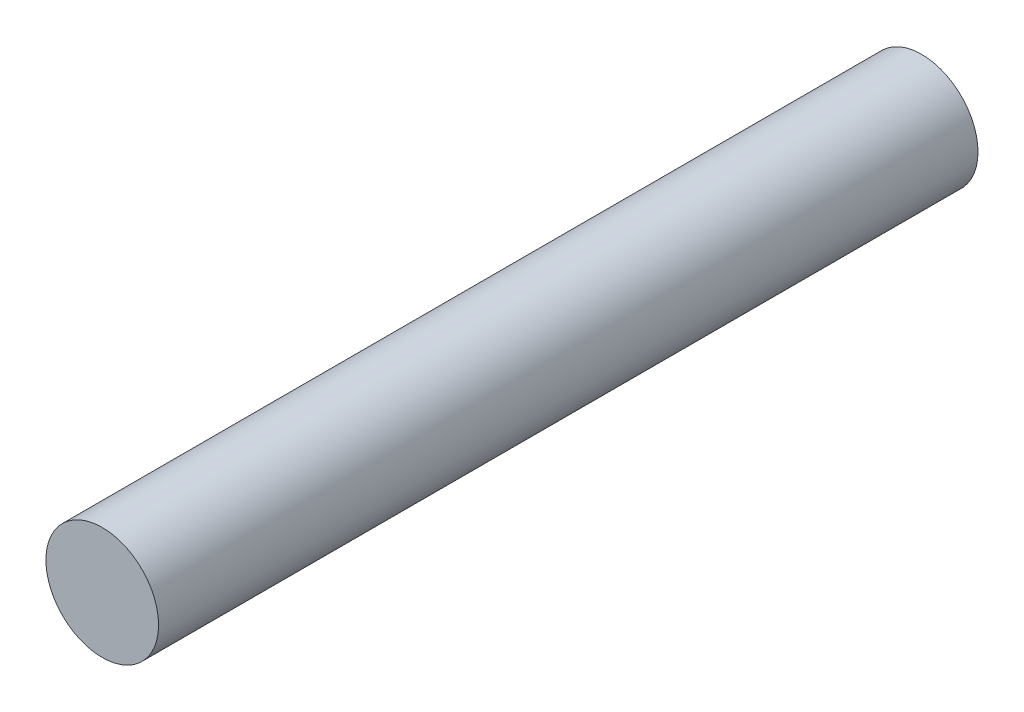
ISO-10303-21;
HEADER;
FILE_DESCRIPTION(('STEP AP214'),'2;1');
FILE_NAME('part.step','',(''),(''),'','','');
FILE_SCHEMA(('AUTOMOTIVE_DESIGN { 1 0 10303 214 1 1 1 1 }'));
ENDSEC;
DATA;
#1=APPLICATION_CONTEXT('core data for automotive mechanical design processes');
#2=APPLICATION_PROTOCOL_DEFINITION('international standard','automotive_design',2000,#1);
#3=PRODUCT_CONTEXT('',#1,'mechanical');
#4=PRODUCT('Part','Part','',(#3));
#5=PRODUCT_RELATED_PRODUCT_CATEGORY('part','',(#4));
#6=PRODUCT_DEFINITION_FORMATION('','',#4);
#7=PRODUCT_DEFINITION_CONTEXT('part definition',#1,'design');
#8=PRODUCT_DEFINITION('design','',#6,#7);
#9=PRODUCT_DEFINITION_SHAPE('','',#8);
#10=(LENGTH_UNIT() NAMED_UNIT(*) SI_UNIT(.MILLI.,.METRE.));
#11=(NAMED_UNIT(*) PLANE_ANGLE_UNIT() SI_UNIT($,.RADIAN.));
#12=(NAMED_UNIT(*) SI_UNIT($,.STERADIAN.) SOLID_ANGLE_UNIT());
#13=UNCERTAINTY_MEASURE_WITH_UNIT(LENGTH_MEASURE(1.E-05),#10,'distance_accuracy_value','');
#14=(GEOMETRIC_REPRESENTATION_CONTEXT(3) GLOBAL_UNCERTAINTY_ASSIGNED_CONTEXT((#13)) GLOBAL_UNIT_ASSIGNED_CONTEXT((#10,
#11,#12)) REPRESENTATION_CONTEXT('',''));
#15=CARTESIAN_POINT('',(0.,0.,0.));
#16=DIRECTION('',(0.,0.,1.));
#17=DIRECTION('',(1.,0.,0.));
#18=AXIS2_PLACEMENT_3D('',#15,#16,#17);
#19=CARTESIAN_POINT('',(0.,0.,40.));
#20=DIRECTION('',(0.,0.,-1.));
#21=DIRECTION('',(-1.,0.,0.));
#22=AXIS2_PLACEMENT_3D('',#19,#20,#21);
#23=CYLINDRICAL_SURFACE('',#22,2.75);
#24=CARTESIAN_POINT('',(0.,0.,40.));
#25=DIRECTION('',(0.,0.,1.));
#26=DIRECTION('',(1.,0.,0.));
#27=AXIS2_PLACEMENT_3D('',#24,#25,#26);
#28=CIRCLE('',#27,2.75);
#29=CARTESIAN_POINT('',(2.75,0.,40.));
#30=VERTEX_POINT('',#29);
#31=EDGE_CURVE('E10',#30,#30,#28,.T.);
#32=ORIENTED_EDGE('',*,*,#31,.F.);
#33=EDGE_LOOP('',(#32));
#34=FACE_BOUND('',#33,.T.);
#35=CARTESIAN_POINT('',(0.,0.,0.));
#36=DIRECTION('',(0.,0.,1.));
#37=DIRECTION('',(1.,0.,0.));
#38=AXIS2_PLACEMENT_3D('',#35,#36,#37);
#39=CIRCLE('',#38,2.75);
#40=CARTESIAN_POINT('',(2.75,0.,0.));
#41=VERTEX_POINT('',#40);
#42=EDGE_CURVE('E40',#41,#41,#39,.T.);
#43=ORIENTED_EDGE('',*,*,#42,.T.);
#44=EDGE_LOOP('',(#43));
#45=FACE_BOUND('',#44,.T.);
#46=ADVANCED_FACE('F37',(#34,#45),#23,.T.);
#47=CARTESIAN_POINT('',(0.,0.,40.));
#48=DIRECTION('',(0.,0.,1.));
#49=DIRECTION('',(1.,0.,0.));
#50=AXIS2_PLACEMENT_3D('',#47,#48,#49);
#51=PLANE('',#50);
#52=ORIENTED_EDGE('',*,*,#31,.T.);
#53=EDGE_LOOP('',(#52));
#54=FACE_BOUND('',#53,.T.);
#55=ADVANCED_FACE('F54',(#54),#51,.T.);
#56=CARTESIAN_POINT('',(0.,0.,0.));
#57=DIRECTION('',(0.,0.,1.));
#58=DIRECTION('',(1.,0.,0.));
#59=AXIS2_PLACEMENT_3D('',#56,#57,#58);
#60=PLANE('',#59);
#61=ORIENTED_EDGE('',*,*,#42,.F.);
#62=EDGE_LOOP('',(#61));
#63=FACE_BOUND('',#62,.T.);
#64=ADVANCED_FACE('F52',(#63),#60,.F.);
#65=CLOSED_SHELL('',(#46,#55,#64));
#66=MANIFOLD_SOLID_BREP('B2',#65);
#67=ADVANCED_BREP_SHAPE_REPRESENTATION('',(#18,#66),#14);
#68=SHAPE_DEFINITION_REPRESENTATION(#9,#67);
ENDSEC;
END-ISO-10303-21;
